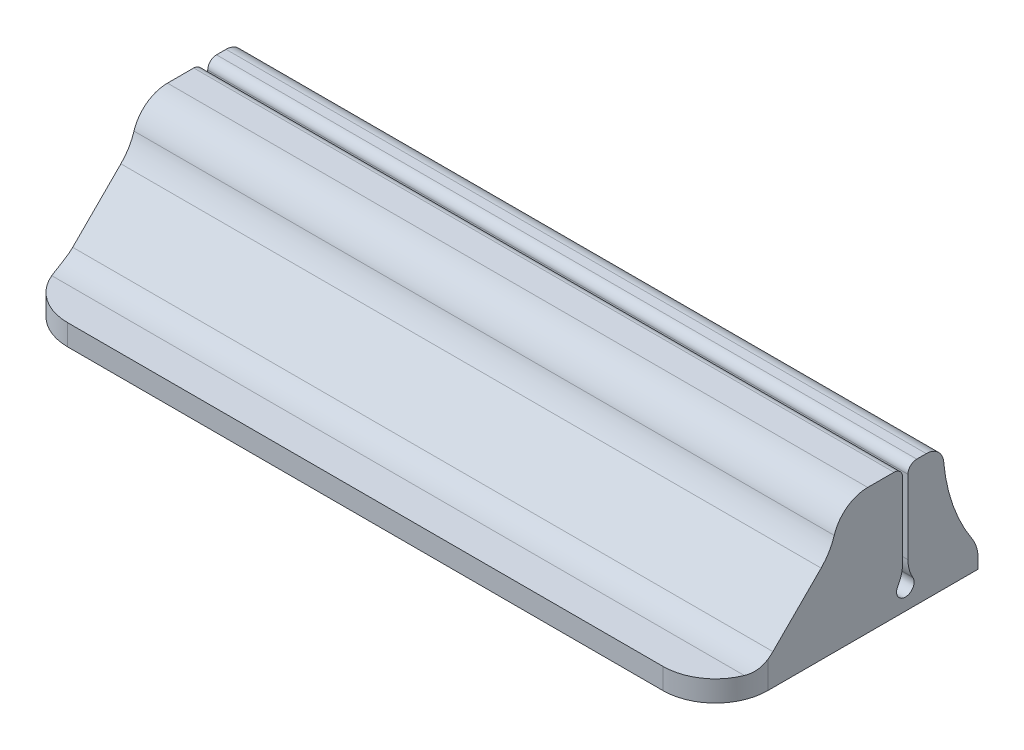
ISO-10303-21;
HEADER;
FILE_DESCRIPTION(('STEP AP214'),'2;1');
FILE_NAME('part.step','',(''),(''),'','','');
FILE_SCHEMA(('AUTOMOTIVE_DESIGN { 1 0 10303 214 1 1 1 1 }'));
ENDSEC;
DATA;
#1=APPLICATION_CONTEXT('core data for automotive mechanical design processes');
#2=APPLICATION_PROTOCOL_DEFINITION('international standard','automotive_design',2000,#1);
#3=PRODUCT_CONTEXT('',#1,'mechanical');
#4=PRODUCT('Part','Part','',(#3));
#5=PRODUCT_RELATED_PRODUCT_CATEGORY('part','',(#4));
#6=PRODUCT_DEFINITION_FORMATION('','',#4);
#7=PRODUCT_DEFINITION_CONTEXT('part definition',#1,'design');
#8=PRODUCT_DEFINITION('design','',#6,#7);
#9=PRODUCT_DEFINITION_SHAPE('','',#8);
#10=(LENGTH_UNIT() NAMED_UNIT(*) SI_UNIT(.MILLI.,.METRE.));
#11=(NAMED_UNIT(*) PLANE_ANGLE_UNIT() SI_UNIT($,.RADIAN.));
#12=(NAMED_UNIT(*) SI_UNIT($,.STERADIAN.) SOLID_ANGLE_UNIT());
#13=UNCERTAINTY_MEASURE_WITH_UNIT(LENGTH_MEASURE(1.E-05),#10,'distance_accuracy_value','');
#14=(GEOMETRIC_REPRESENTATION_CONTEXT(3) GLOBAL_UNCERTAINTY_ASSIGNED_CONTEXT((#13)) GLOBAL_UNIT_ASSIGNED_CONTEXT((#10,
#11,#12)) REPRESENTATION_CONTEXT('',''));
#15=CARTESIAN_POINT('',(0.,0.,0.));
#16=DIRECTION('',(0.,0.,1.));
#17=DIRECTION('',(1.,0.,0.));
#18=AXIS2_PLACEMENT_3D('',#15,#16,#17);
#19=CARTESIAN_POINT('',(0.,1.2,0.));
#20=DIRECTION('',(0.,1.,0.));
#21=DIRECTION('',(0.,0.,1.));
#22=AXIS2_PLACEMENT_3D('',#19,#20,#21);
#23=PLANE('',#22);
#24=DIRECTION('',(1.,0.,0.));
#25=VECTOR('',#24,1.);
#26=CARTESIAN_POINT('',(-20.,1.2,7.5));
#27=LINE('',#26,#25);
#28=CARTESIAN_POINT('',(-17.,1.2,7.5));
#29=VERTEX_POINT('',#28);
#30=CARTESIAN_POINT('',(17.,1.2,7.5));
#31=VERTEX_POINT('',#30);
#32=EDGE_CURVE('E236',#29,#31,#27,.T.);
#33=ORIENTED_EDGE('',*,*,#32,.T.);
#34=CARTESIAN_POINT('',(17.,1.2,4.5));
#35=DIRECTION('',(0.,1.,0.));
#36=DIRECTION('',(0.,0.,1.));
#37=AXIS2_PLACEMENT_3D('',#34,#35,#36);
#38=CIRCLE('',#37,3.);
#39=CARTESIAN_POINT('',(19.7796856340488,1.2,5.62842712474618));
#40=VERTEX_POINT('',#39);
#41=EDGE_CURVE('E340',#31,#40,#38,.T.);
#42=ORIENTED_EDGE('',*,*,#41,.T.);
#43=DIRECTION('',(-1.,0.,0.));
#44=VECTOR('',#43,1.);
#45=CARTESIAN_POINT('',(0.,1.2,5.62842712474618));
#46=LINE('',#45,#44);
#47=CARTESIAN_POINT('',(-19.7796856340488,1.2,5.62842712474618));
#48=VERTEX_POINT('',#47);
#49=EDGE_CURVE('E247',#40,#48,#46,.T.);
#50=ORIENTED_EDGE('',*,*,#49,.T.);
#51=CARTESIAN_POINT('',(-17.,1.2,4.5));
#52=DIRECTION('',(0.,1.,0.));
#53=DIRECTION('',(0.,0.,1.));
#54=AXIS2_PLACEMENT_3D('',#51,#52,#53);
#55=CIRCLE('',#54,3.);
#56=EDGE_CURVE('E338',#48,#29,#55,.T.);
#57=ORIENTED_EDGE('',*,*,#56,.T.);
#58=EDGE_LOOP('',(#33,#42,#50,#57));
#59=FACE_BOUND('',#58,.T.);
#60=ADVANCED_FACE('F53',(#59),#23,.T.);
#61=CARTESIAN_POINT('',(20.,1.2,-7.5));
#62=DIRECTION('',(-1.,0.,0.));
#63=DIRECTION('',(0.,0.,1.));
#64=AXIS2_PLACEMENT_3D('',#61,#62,#63);
#65=PLANE('',#64);
#66=CARTESIAN_POINT('',(20.,3.2,5.62842712474618));
#67=DIRECTION('',(-1.,0.,0.));
#68=DIRECTION('',(0.,0.,1.));
#69=AXIS2_PLACEMENT_3D('',#66,#67,#68);
#70=CIRCLE('',#69,2.);
#71=CARTESIAN_POINT('',(20.,1.78578643762691,4.21421356237308));
#72=VERTEX_POINT('',#71);
#73=CARTESIAN_POINT('',(20.,1.54874222965127,4.5));
#74=VERTEX_POINT('',#73);
#75=EDGE_CURVE('E262',#72,#74,#70,.T.);
#76=ORIENTED_EDGE('',*,*,#75,.T.);
#77=DIRECTION('',(0.,-1.,0.));
#78=VECTOR('',#77,1.);
#79=CARTESIAN_POINT('',(20.,1.2,4.5));
#80=LINE('',#79,#78);
#81=CARTESIAN_POINT('',(20.,0.,4.5));
#82=VERTEX_POINT('',#81);
#83=EDGE_CURVE('E211',#74,#82,#80,.T.);
#84=ORIENTED_EDGE('',*,*,#83,.T.);
#85=DIRECTION('',(0.,0.,-1.));
#86=VECTOR('',#85,1.);
#87=CARTESIAN_POINT('',(20.,0.,-7.5));
#88=LINE('',#87,#86);
#89=CARTESIAN_POINT('',(20.,0.,-7.5));
#90=VERTEX_POINT('',#89);
#91=EDGE_CURVE('E204',#82,#90,#88,.T.);
#92=ORIENTED_EDGE('',*,*,#91,.T.);
#93=DIRECTION('',(0.,-1.,0.));
#94=VECTOR('',#93,1.);
#95=CARTESIAN_POINT('',(20.,1.2,-7.5));
#96=LINE('',#95,#94);
#97=CARTESIAN_POINT('',(20.,0.566750419289201,-7.5));
#98=VERTEX_POINT('',#97);
#99=EDGE_CURVE('E208',#98,#90,#96,.T.);
#100=ORIENTED_EDGE('',*,*,#99,.F.);
#101=CARTESIAN_POINT('',(20.,0.566750419289201,-5.5));
#102=DIRECTION('',(-1.,0.,0.));
#103=DIRECTION('',(0.,0.,1.));
#104=AXIS2_PLACEMENT_3D('',#101,#102,#103);
#105=CIRCLE('',#104,2.);
#106=CARTESIAN_POINT('',(20.,1.67229201607433,-7.16666666666667));
#107=VERTEX_POINT('',#106);
#108=EDGE_CURVE('E299',#98,#107,#105,.F.);
#109=ORIENTED_EDGE('',*,*,#108,.T.);
#110=CARTESIAN_POINT('',(20.,7.2,-15.5));
#111=DIRECTION('',(-1.,0.,0.));
#112=DIRECTION('',(0.,0.,1.));
#113=AXIS2_PLACEMENT_3D('',#110,#111,#112);
#114=CIRCLE('',#113,10.);
#115=CARTESIAN_POINT('',(20.,6.29090909090909,-5.54140804536062));
#116=VERTEX_POINT('',#115);
#117=EDGE_CURVE('E240',#107,#116,#114,.T.);
#118=ORIENTED_EDGE('',*,*,#117,.T.);
#119=CARTESIAN_POINT('',(20.,6.2,-4.54554884989668));
#120=DIRECTION('',(-1.,0.,0.));
#121=DIRECTION('',(0.,0.,1.));
#122=AXIS2_PLACEMENT_3D('',#119,#120,#121);
#123=CIRCLE('',#122,1.);
#124=CARTESIAN_POINT('',(20.,7.2,-4.54554884989668));
#125=VERTEX_POINT('',#124);
#126=EDGE_CURVE('E291',#116,#125,#123,.F.);
#127=ORIENTED_EDGE('',*,*,#126,.T.);
#128=DIRECTION('',(0.,0.,-1.));
#129=VECTOR('',#128,1.);
#130=CARTESIAN_POINT('',(20.,7.2,-5.5));
#131=LINE('',#130,#129);
#132=CARTESIAN_POINT('',(20.,7.2,-4.));
#133=VERTEX_POINT('',#132);
#134=EDGE_CURVE('E444',#133,#125,#131,.T.);
#135=ORIENTED_EDGE('',*,*,#134,.F.);
#136=CARTESIAN_POINT('',(20.,6.7,-4.));
#137=DIRECTION('',(-1.,0.,0.));
#138=DIRECTION('',(0.,0.,1.));
#139=AXIS2_PLACEMENT_3D('',#136,#137,#138);
#140=CIRCLE('',#139,0.5);
#141=CARTESIAN_POINT('',(20.,6.7,-3.5));
#142=VERTEX_POINT('',#141);
#143=EDGE_CURVE('E269',#133,#142,#140,.F.);
#144=ORIENTED_EDGE('',*,*,#143,.T.);
#145=DIRECTION('',(0.,-1.,0.));
#146=VECTOR('',#145,1.);
#147=CARTESIAN_POINT('',(20.,7.2,-3.5));
#148=LINE('',#147,#146);
#149=CARTESIAN_POINT('',(20.,2.47573508221729,-3.5));
#150=VERTEX_POINT('',#149);
#151=EDGE_CURVE('E448',#142,#150,#148,.T.);
#152=ORIENTED_EDGE('',*,*,#151,.T.);
#153=CARTESIAN_POINT('',(20.,2.47573508221729,-5.50000000000001));
#154=DIRECTION('',(-1.,0.,0.));
#155=DIRECTION('',(0.,0.,1.));
#156=AXIS2_PLACEMENT_3D('',#153,#154,#155);
#157=CIRCLE('',#156,2.);
#158=CARTESIAN_POINT('',(20.,1.45514701644346,-3.78));
#159=VERTEX_POINT('',#158);
#160=EDGE_CURVE('E316',#150,#159,#157,.F.);
#161=ORIENTED_EDGE('',*,*,#160,.T.);
#162=CARTESIAN_POINT('',(20.,1.2,-3.35));
#163=DIRECTION('',(1.,0.,0.));
#164=DIRECTION('',(0.,0.,-1.));
#165=AXIS2_PLACEMENT_3D('',#162,#163,#164);
#166=CIRCLE('',#165,0.5);
#167=CARTESIAN_POINT('',(20.,1.45514701644346,-2.92));
#168=VERTEX_POINT('',#167);
#169=EDGE_CURVE('E491',#168,#159,#166,.T.);
#170=ORIENTED_EDGE('',*,*,#169,.F.);
#171=CARTESIAN_POINT('',(20.,2.47573508221732,-1.20000000000001));
#172=DIRECTION('',(-1.,0.,0.));
#173=DIRECTION('',(0.,0.,1.));
#174=AXIS2_PLACEMENT_3D('',#171,#172,#173);
#175=CIRCLE('',#174,2.);
#176=CARTESIAN_POINT('',(20.,2.47573508221732,-3.2));
#177=VERTEX_POINT('',#176);
#178=EDGE_CURVE('E318',#168,#177,#175,.F.);
#179=ORIENTED_EDGE('',*,*,#178,.T.);
#180=DIRECTION('',(0.,-1.,0.));
#181=VECTOR('',#180,1.);
#182=CARTESIAN_POINT('',(20.,7.2,-3.2));
#183=LINE('',#182,#181);
#184=CARTESIAN_POINT('',(20.,6.7,-3.2));
#185=VERTEX_POINT('',#184);
#186=EDGE_CURVE('E483',#185,#177,#183,.T.);
#187=ORIENTED_EDGE('',*,*,#186,.F.);
#188=CARTESIAN_POINT('',(20.,6.7,-2.7));
#189=DIRECTION('',(-1.,0.,0.));
#190=DIRECTION('',(0.,0.,1.));
#191=AXIS2_PLACEMENT_3D('',#188,#189,#190);
#192=CIRCLE('',#191,0.5);
#193=CARTESIAN_POINT('',(20.,7.2,-2.7));
#194=VERTEX_POINT('',#193);
#195=EDGE_CURVE('E267',#185,#194,#192,.F.);
#196=ORIENTED_EDGE('',*,*,#195,.T.);
#197=DIRECTION('',(0.,0.,-1.));
#198=VECTOR('',#197,1.);
#199=CARTESIAN_POINT('',(20.,7.2,-3.2));
#200=LINE('',#199,#198);
#201=CARTESIAN_POINT('',(20.,7.2,-1.2));
#202=VERTEX_POINT('',#201);
#203=EDGE_CURVE('E475',#202,#194,#200,.T.);
#204=ORIENTED_EDGE('',*,*,#203,.F.);
#205=CARTESIAN_POINT('',(20.,5.2,-1.2));
#206=DIRECTION('',(-1.,0.,0.));
#207=DIRECTION('',(0.,0.,1.));
#208=AXIS2_PLACEMENT_3D('',#205,#206,#207);
#209=CIRCLE('',#208,2.);
#210=CARTESIAN_POINT('',(20.,5.78431620583809,0.712740069009633));
#211=VERTEX_POINT('',#210);
#212=EDGE_CURVE('E255',#202,#211,#209,.F.);
#213=ORIENTED_EDGE('',*,*,#212,.T.);
#214=CARTESIAN_POINT('',(20.,6.66079051459522,3.58185017252408));
#215=DIRECTION('',(-1.,0.,0.));
#216=DIRECTION('',(0.,0.,1.));
#217=AXIS2_PLACEMENT_3D('',#214,#215,#216);
#218=CIRCLE('',#217,3.);
#219=CARTESIAN_POINT('',(20.,4.53947017103559,1.46052982896443));
#220=VERTEX_POINT('',#219);
#221=EDGE_CURVE('E306',#211,#220,#218,.T.);
#222=ORIENTED_EDGE('',*,*,#221,.T.);
#223=DIRECTION('',(0.,-0.707106781186551,0.707106781186544));
#224=VECTOR('',#223,1.);
#225=CARTESIAN_POINT('',(20.,7.34999999999999,-1.34999999999995));
#226=LINE('',#225,#224);
#227=EDGE_CURVE('E242',#220,#72,#226,.T.);
#228=ORIENTED_EDGE('',*,*,#227,.T.);
#229=EDGE_LOOP('',(#76,#84,#92,#100,#109,#118,#127,#135,#144,#152,#161,#170,#179,#187,#196,#204,
#213,#222,#228));
#230=FACE_BOUND('',#229,.T.);
#231=ADVANCED_FACE('F207',(#230),#65,.F.);
#232=CARTESIAN_POINT('',(-20.,1.2,-7.5));
#233=DIRECTION('',(0.,0.,1.));
#234=DIRECTION('',(1.,0.,0.));
#235=AXIS2_PLACEMENT_3D('',#232,#233,#234);
#236=PLANE('',#235);
#237=DIRECTION('',(0.,-1.,0.));
#238=VECTOR('',#237,1.);
#239=CARTESIAN_POINT('',(-20.,1.2,-7.5));
#240=LINE('',#239,#238);
#241=CARTESIAN_POINT('',(-20.,0.566750419289201,-7.5));
#242=VERTEX_POINT('',#241);
#243=CARTESIAN_POINT('',(-20.,0.,-7.5));
#244=VERTEX_POINT('',#243);
#245=EDGE_CURVE('E225',#242,#244,#240,.T.);
#246=ORIENTED_EDGE('',*,*,#245,.F.);
#247=DIRECTION('',(1.,0.,0.));
#248=VECTOR('',#247,1.);
#249=CARTESIAN_POINT('',(-20.,0.566750419289201,-7.5));
#250=LINE('',#249,#248);
#251=EDGE_CURVE('E223',#242,#98,#250,.T.);
#252=ORIENTED_EDGE('',*,*,#251,.T.);
#253=ORIENTED_EDGE('',*,*,#99,.T.);
#254=DIRECTION('',(-1.,0.,0.));
#255=VECTOR('',#254,1.);
#256=CARTESIAN_POINT('',(-20.,0.,-7.5));
#257=LINE('',#256,#255);
#258=EDGE_CURVE('E214',#90,#244,#257,.T.);
#259=ORIENTED_EDGE('',*,*,#258,.T.);
#260=EDGE_LOOP('',(#246,#252,#253,#259));
#261=FACE_BOUND('',#260,.T.);
#262=ADVANCED_FACE('F220',(#261),#236,.F.);
#263=CARTESIAN_POINT('',(-20.,1.2,-7.5));
#264=DIRECTION('',(1.,0.,0.));
#265=DIRECTION('',(0.,0.,-1.));
#266=AXIS2_PLACEMENT_3D('',#263,#264,#265);
#267=PLANE('',#266);
#268=DIRECTION('',(0.,0.,1.));
#269=VECTOR('',#268,1.);
#270=CARTESIAN_POINT('',(-20.,0.,-7.5));
#271=LINE('',#270,#269);
#272=CARTESIAN_POINT('',(-20.,0.,4.5));
#273=VERTEX_POINT('',#272);
#274=EDGE_CURVE('E228',#244,#273,#271,.T.);
#275=ORIENTED_EDGE('',*,*,#274,.T.);
#276=DIRECTION('',(0.,-1.,0.));
#277=VECTOR('',#276,1.);
#278=CARTESIAN_POINT('',(-20.,1.2,4.5));
#279=LINE('',#278,#277);
#280=CARTESIAN_POINT('',(-20.,1.54874222965127,4.5));
#281=VERTEX_POINT('',#280);
#282=EDGE_CURVE('E12',#273,#281,#279,.F.);
#283=ORIENTED_EDGE('',*,*,#282,.T.);
#284=CARTESIAN_POINT('',(-20.,3.2,5.62842712474618));
#285=DIRECTION('',(1.,0.,0.));
#286=DIRECTION('',(0.,0.,-1.));
#287=AXIS2_PLACEMENT_3D('',#284,#285,#286);
#288=CIRCLE('',#287,2.);
#289=CARTESIAN_POINT('',(-20.,1.78578643762691,4.21421356237308));
#290=VERTEX_POINT('',#289);
#291=EDGE_CURVE('E260',#281,#290,#288,.T.);
#292=ORIENTED_EDGE('',*,*,#291,.T.);
#293=DIRECTION('',(0.,0.707106781186551,-0.707106781186544));
#294=VECTOR('',#293,1.);
#295=CARTESIAN_POINT('',(-20.,7.34999999999999,-1.34999999999995));
#296=LINE('',#295,#294);
#297=CARTESIAN_POINT('',(-20.,4.53947017103559,1.46052982896443));
#298=VERTEX_POINT('',#297);
#299=EDGE_CURVE('E244',#290,#298,#296,.T.);
#300=ORIENTED_EDGE('',*,*,#299,.T.);
#301=CARTESIAN_POINT('',(-20.,6.66079051459522,3.58185017252408));
#302=DIRECTION('',(1.,0.,0.));
#303=DIRECTION('',(0.,0.,-1.));
#304=AXIS2_PLACEMENT_3D('',#301,#302,#303);
#305=CIRCLE('',#304,3.);
#306=CARTESIAN_POINT('',(-20.,5.78431620583809,0.712740069009633));
#307=VERTEX_POINT('',#306);
#308=EDGE_CURVE('E308',#298,#307,#305,.T.);
#309=ORIENTED_EDGE('',*,*,#308,.T.);
#310=CARTESIAN_POINT('',(-20.,5.2,-1.2));
#311=DIRECTION('',(1.,0.,0.));
#312=DIRECTION('',(0.,0.,-1.));
#313=AXIS2_PLACEMENT_3D('',#310,#311,#312);
#314=CIRCLE('',#313,2.);
#315=CARTESIAN_POINT('',(-20.,7.2,-1.2));
#316=VERTEX_POINT('',#315);
#317=EDGE_CURVE('E258',#307,#316,#314,.F.);
#318=ORIENTED_EDGE('',*,*,#317,.T.);
#319=DIRECTION('',(0.,0.,1.));
#320=VECTOR('',#319,1.);
#321=CARTESIAN_POINT('',(-20.,7.2,-3.2));
#322=LINE('',#321,#320);
#323=CARTESIAN_POINT('',(-20.,7.2,-2.7));
#324=VERTEX_POINT('',#323);
#325=EDGE_CURVE('E453',#324,#316,#322,.T.);
#326=ORIENTED_EDGE('',*,*,#325,.F.);
#327=CARTESIAN_POINT('',(-20.,6.7,-2.7));
#328=DIRECTION('',(1.,0.,0.));
#329=DIRECTION('',(0.,0.,-1.));
#330=AXIS2_PLACEMENT_3D('',#327,#328,#329);
#331=CIRCLE('',#330,0.5);
#332=CARTESIAN_POINT('',(-20.,6.7,-3.2));
#333=VERTEX_POINT('',#332);
#334=EDGE_CURVE('E273',#324,#333,#331,.F.);
#335=ORIENTED_EDGE('',*,*,#334,.T.);
#336=DIRECTION('',(0.,-1.,0.));
#337=VECTOR('',#336,1.);
#338=CARTESIAN_POINT('',(-20.,7.2,-3.2));
#339=LINE('',#338,#337);
#340=CARTESIAN_POINT('',(-20.,2.47573508221732,-3.2));
#341=VERTEX_POINT('',#340);
#342=EDGE_CURVE('E479',#333,#341,#339,.T.);
#343=ORIENTED_EDGE('',*,*,#342,.T.);
#344=CARTESIAN_POINT('',(-20.,2.47573508221732,-1.2));
#345=DIRECTION('',(1.,0.,0.));
#346=DIRECTION('',(0.,0.,-1.));
#347=AXIS2_PLACEMENT_3D('',#344,#345,#346);
#348=CIRCLE('',#347,2.);
#349=CARTESIAN_POINT('',(-20.,1.45514701644346,-2.91999999999999));
#350=VERTEX_POINT('',#349);
#351=EDGE_CURVE('E324',#341,#350,#348,.F.);
#352=ORIENTED_EDGE('',*,*,#351,.T.);
#353=CARTESIAN_POINT('',(-20.,1.2,-3.34999999999999));
#354=DIRECTION('',(1.,0.,0.));
#355=DIRECTION('',(0.,0.,-1.));
#356=AXIS2_PLACEMENT_3D('',#353,#354,#355);
#357=CIRCLE('',#356,0.5);
#358=CARTESIAN_POINT('',(-20.,1.45514701644346,-3.77999999999999));
#359=VERTEX_POINT('',#358);
#360=EDGE_CURVE('E488',#359,#350,#357,.F.);
#361=ORIENTED_EDGE('',*,*,#360,.F.);
#362=CARTESIAN_POINT('',(-20.,2.47573508221729,-5.5));
#363=DIRECTION('',(1.,0.,0.));
#364=DIRECTION('',(0.,0.,-1.));
#365=AXIS2_PLACEMENT_3D('',#362,#363,#364);
#366=CIRCLE('',#365,2.);
#367=CARTESIAN_POINT('',(-20.,2.47573508221729,-3.5));
#368=VERTEX_POINT('',#367);
#369=EDGE_CURVE('E322',#359,#368,#366,.F.);
#370=ORIENTED_EDGE('',*,*,#369,.T.);
#371=DIRECTION('',(0.,-1.,0.));
#372=VECTOR('',#371,1.);
#373=CARTESIAN_POINT('',(-20.,7.2,-3.5));
#374=LINE('',#373,#372);
#375=CARTESIAN_POINT('',(-20.,6.7,-3.5));
#376=VERTEX_POINT('',#375);
#377=EDGE_CURVE('E215',#376,#368,#374,.T.);
#378=ORIENTED_EDGE('',*,*,#377,.F.);
#379=CARTESIAN_POINT('',(-20.,6.7,-4.));
#380=DIRECTION('',(1.,0.,0.));
#381=DIRECTION('',(0.,0.,-1.));
#382=AXIS2_PLACEMENT_3D('',#379,#380,#381);
#383=CIRCLE('',#382,0.5);
#384=CARTESIAN_POINT('',(-20.,7.2,-4.));
#385=VERTEX_POINT('',#384);
#386=EDGE_CURVE('E275',#376,#385,#383,.F.);
#387=ORIENTED_EDGE('',*,*,#386,.T.);
#388=DIRECTION('',(0.,0.,1.));
#389=VECTOR('',#388,1.);
#390=CARTESIAN_POINT('',(-20.,7.2,-5.5));
#391=LINE('',#390,#389);
#392=CARTESIAN_POINT('',(-20.,7.2,-4.54554884989668));
#393=VERTEX_POINT('',#392);
#394=EDGE_CURVE('E449',#393,#385,#391,.T.);
#395=ORIENTED_EDGE('',*,*,#394,.F.);
#396=CARTESIAN_POINT('',(-20.,6.2,-4.54554884989668));
#397=DIRECTION('',(1.,0.,0.));
#398=DIRECTION('',(0.,0.,-1.));
#399=AXIS2_PLACEMENT_3D('',#396,#397,#398);
#400=CIRCLE('',#399,1.);
#401=CARTESIAN_POINT('',(-20.,6.29090909090909,-5.54140804536062));
#402=VERTEX_POINT('',#401);
#403=EDGE_CURVE('E286',#393,#402,#400,.F.);
#404=ORIENTED_EDGE('',*,*,#403,.T.);
#405=CARTESIAN_POINT('',(-20.,7.2,-15.5));
#406=DIRECTION('',(1.,0.,0.));
#407=DIRECTION('',(0.,0.,-1.));
#408=AXIS2_PLACEMENT_3D('',#405,#406,#407);
#409=CIRCLE('',#408,10.);
#410=CARTESIAN_POINT('',(-20.,1.67229201607433,-7.16666666666667));
#411=VERTEX_POINT('',#410);
#412=EDGE_CURVE('E224',#402,#411,#409,.T.);
#413=ORIENTED_EDGE('',*,*,#412,.T.);
#414=CARTESIAN_POINT('',(-20.,0.566750419289201,-5.5));
#415=DIRECTION('',(1.,0.,0.));
#416=DIRECTION('',(0.,0.,-1.));
#417=AXIS2_PLACEMENT_3D('',#414,#415,#416);
#418=CIRCLE('',#417,2.);
#419=EDGE_CURVE('E296',#411,#242,#418,.F.);
#420=ORIENTED_EDGE('',*,*,#419,.T.);
#421=ORIENTED_EDGE('',*,*,#245,.T.);
#422=EDGE_LOOP('',(#275,#283,#292,#300,#309,#318,#326,#335,#343,#352,#361,#370,#378,#387,#395,
#404,#413,#420,#421));
#423=FACE_BOUND('',#422,.T.);
#424=ADVANCED_FACE('F418',(#423),#267,.F.);
#425=CARTESIAN_POINT('',(-20.,1.2,7.5));
#426=DIRECTION('',(0.,0.,-1.));
#427=DIRECTION('',(-1.,0.,0.));
#428=AXIS2_PLACEMENT_3D('',#425,#426,#427);
#429=PLANE('',#428);
#430=DIRECTION('',(1.,0.,0.));
#431=VECTOR('',#430,1.);
#432=CARTESIAN_POINT('',(-20.,0.,7.5));
#433=LINE('',#432,#431);
#434=CARTESIAN_POINT('',(-17.,0.,7.5));
#435=VERTEX_POINT('',#434);
#436=CARTESIAN_POINT('',(17.,0.,7.5));
#437=VERTEX_POINT('',#436);
#438=EDGE_CURVE('E230',#435,#437,#433,.T.);
#439=ORIENTED_EDGE('',*,*,#438,.T.);
#440=DIRECTION('',(0.,-1.,0.));
#441=VECTOR('',#440,1.);
#442=CARTESIAN_POINT('',(17.,1.2,7.5));
#443=LINE('',#442,#441);
#444=EDGE_CURVE('E336',#437,#31,#443,.F.);
#445=ORIENTED_EDGE('',*,*,#444,.T.);
#446=ORIENTED_EDGE('',*,*,#32,.F.);
#447=DIRECTION('',(0.,-1.,0.));
#448=VECTOR('',#447,1.);
#449=CARTESIAN_POINT('',(-17.,1.2,7.5));
#450=LINE('',#449,#448);
#451=EDGE_CURVE('E333',#29,#435,#450,.T.);
#452=ORIENTED_EDGE('',*,*,#451,.T.);
#453=EDGE_LOOP('',(#439,#445,#446,#452));
#454=FACE_BOUND('',#453,.T.);
#455=ADVANCED_FACE('F415',(#454),#429,.F.);
#456=CARTESIAN_POINT('',(0.,0.,0.));
#457=DIRECTION('',(0.,1.,0.));
#458=DIRECTION('',(0.,0.,1.));
#459=AXIS2_PLACEMENT_3D('',#456,#457,#458);
#460=PLANE('',#459);
#461=ORIENTED_EDGE('',*,*,#91,.F.);
#462=CARTESIAN_POINT('',(17.,0.,4.5));
#463=DIRECTION('',(0.,1.,0.));
#464=DIRECTION('',(0.,0.,1.));
#465=AXIS2_PLACEMENT_3D('',#462,#463,#464);
#466=CIRCLE('',#465,3.);
#467=EDGE_CURVE('E331',#82,#437,#466,.F.);
#468=ORIENTED_EDGE('',*,*,#467,.T.);
#469=ORIENTED_EDGE('',*,*,#438,.F.);
#470=CARTESIAN_POINT('',(-17.,0.,4.5));
#471=DIRECTION('',(0.,1.,0.));
#472=DIRECTION('',(0.,0.,1.));
#473=AXIS2_PLACEMENT_3D('',#470,#471,#472);
#474=CIRCLE('',#473,3.);
#475=EDGE_CURVE('E329',#435,#273,#474,.F.);
#476=ORIENTED_EDGE('',*,*,#475,.T.);
#477=ORIENTED_EDGE('',*,*,#274,.F.);
#478=ORIENTED_EDGE('',*,*,#258,.F.);
#479=EDGE_LOOP('',(#461,#468,#469,#476,#477,#478));
#480=FACE_BOUND('',#479,.T.);
#481=ADVANCED_FACE('F227',(#480),#460,.F.);
#482=CARTESIAN_POINT('',(-20.,7.2,-3.5));
#483=DIRECTION('',(0.,0.,-1.));
#484=DIRECTION('',(-1.,0.,0.));
#485=AXIS2_PLACEMENT_3D('',#482,#483,#484);
#486=PLANE('',#485);
#487=ORIENTED_EDGE('',*,*,#377,.T.);
#488=DIRECTION('',(1.,0.,0.));
#489=VECTOR('',#488,1.);
#490=CARTESIAN_POINT('',(-20.,2.47573508221729,-3.5));
#491=LINE('',#490,#489);
#492=EDGE_CURVE('E326',#368,#150,#491,.T.);
#493=ORIENTED_EDGE('',*,*,#492,.T.);
#494=ORIENTED_EDGE('',*,*,#151,.F.);
#495=DIRECTION('',(1.,0.,0.));
#496=VECTOR('',#495,1.);
#497=CARTESIAN_POINT('',(-20.,6.7,-3.5));
#498=LINE('',#497,#496);
#499=EDGE_CURVE('E271',#142,#376,#498,.F.);
#500=ORIENTED_EDGE('',*,*,#499,.T.);
#501=EDGE_LOOP('',(#487,#493,#494,#500));
#502=FACE_BOUND('',#501,.T.);
#503=ADVANCED_FACE('F411',(#502),#486,.F.);
#504=CARTESIAN_POINT('',(0.,7.2,0.));
#505=DIRECTION('',(0.,1.,0.));
#506=DIRECTION('',(0.,0.,1.));
#507=AXIS2_PLACEMENT_3D('',#504,#505,#506);
#508=PLANE('',#507);
#509=ORIENTED_EDGE('',*,*,#134,.T.);
#510=DIRECTION('',(-1.,0.,0.));
#511=VECTOR('',#510,1.);
#512=CARTESIAN_POINT('',(-20.,7.2,-4.54554884989668));
#513=LINE('',#512,#511);
#514=EDGE_CURVE('E283',#125,#393,#513,.T.);
#515=ORIENTED_EDGE('',*,*,#514,.T.);
#516=ORIENTED_EDGE('',*,*,#394,.T.);
#517=DIRECTION('',(1.,0.,0.));
#518=VECTOR('',#517,1.);
#519=CARTESIAN_POINT('',(20.,7.2,-4.));
#520=LINE('',#519,#518);
#521=EDGE_CURVE('E264',#385,#133,#520,.T.);
#522=ORIENTED_EDGE('',*,*,#521,.T.);
#523=EDGE_LOOP('',(#509,#515,#516,#522));
#524=FACE_BOUND('',#523,.T.);
#525=ADVANCED_FACE('F446',(#524),#508,.T.);
#526=CARTESIAN_POINT('',(-20.,7.2,-3.2));
#527=DIRECTION('',(0.,0.,1.));
#528=DIRECTION('',(1.,0.,0.));
#529=AXIS2_PLACEMENT_3D('',#526,#527,#528);
#530=PLANE('',#529);
#531=ORIENTED_EDGE('',*,*,#186,.T.);
#532=DIRECTION('',(1.,0.,0.));
#533=VECTOR('',#532,1.);
#534=CARTESIAN_POINT('',(-20.,2.47573508221732,-3.2));
#535=LINE('',#534,#533);
#536=EDGE_CURVE('E320',#177,#341,#535,.F.);
#537=ORIENTED_EDGE('',*,*,#536,.T.);
#538=ORIENTED_EDGE('',*,*,#342,.F.);
#539=DIRECTION('',(-1.,0.,0.));
#540=VECTOR('',#539,1.);
#541=CARTESIAN_POINT('',(20.,6.7,-3.2));
#542=LINE('',#541,#540);
#543=EDGE_CURVE('E281',#333,#185,#542,.F.);
#544=ORIENTED_EDGE('',*,*,#543,.T.);
#545=EDGE_LOOP('',(#531,#537,#538,#544));
#546=FACE_BOUND('',#545,.T.);
#547=ADVANCED_FACE('F432',(#546),#530,.F.);
#548=CARTESIAN_POINT('',(0.,7.2,0.));
#549=DIRECTION('',(0.,1.,0.));
#550=DIRECTION('',(0.,0.,1.));
#551=AXIS2_PLACEMENT_3D('',#548,#549,#550);
#552=PLANE('',#551);
#553=ORIENTED_EDGE('',*,*,#203,.T.);
#554=DIRECTION('',(-1.,0.,0.));
#555=VECTOR('',#554,1.);
#556=CARTESIAN_POINT('',(-20.,7.2,-2.7));
#557=LINE('',#556,#555);
#558=EDGE_CURVE('E278',#194,#324,#557,.T.);
#559=ORIENTED_EDGE('',*,*,#558,.T.);
#560=ORIENTED_EDGE('',*,*,#325,.T.);
#561=DIRECTION('',(1.,0.,0.));
#562=VECTOR('',#561,1.);
#563=CARTESIAN_POINT('',(20.,7.2,-1.2));
#564=LINE('',#563,#562);
#565=EDGE_CURVE('E252',#316,#202,#564,.T.);
#566=ORIENTED_EDGE('',*,*,#565,.T.);
#567=EDGE_LOOP('',(#553,#559,#560,#566));
#568=FACE_BOUND('',#567,.T.);
#569=ADVANCED_FACE('F425',(#568),#552,.T.);
#570=CARTESIAN_POINT('',(0.,7.2,-15.5));
#571=DIRECTION('',(1.,0.,0.));
#572=DIRECTION('',(0.,0.,-1.));
#573=AXIS2_PLACEMENT_3D('',#570,#571,#572);
#574=CYLINDRICAL_SURFACE('',#573,10.);
#575=ORIENTED_EDGE('',*,*,#117,.F.);
#576=DIRECTION('',(1.,0.,0.));
#577=VECTOR('',#576,1.);
#578=CARTESIAN_POINT('',(0.,1.67229201607433,-7.16666666666667));
#579=LINE('',#578,#577);
#580=EDGE_CURVE('E293',#107,#411,#579,.F.);
#581=ORIENTED_EDGE('',*,*,#580,.T.);
#582=ORIENTED_EDGE('',*,*,#412,.F.);
#583=DIRECTION('',(1.,0.,0.));
#584=VECTOR('',#583,1.);
#585=CARTESIAN_POINT('',(0.,6.29090909090909,-5.54140804536062));
#586=LINE('',#585,#584);
#587=EDGE_CURVE('E288',#402,#116,#586,.T.);
#588=ORIENTED_EDGE('',*,*,#587,.T.);
#589=EDGE_LOOP('',(#575,#581,#582,#588));
#590=FACE_BOUND('',#589,.T.);
#591=ADVANCED_FACE('F423',(#590),#574,.F.);
#592=CARTESIAN_POINT('',(-20.,5.20000000000003,0.799999999999999));
#593=DIRECTION('',(0.,-0.707106781186544,-0.707106781186551));
#594=DIRECTION('',(1.,0.,0.));
#595=AXIS2_PLACEMENT_3D('',#592,#593,#594);
#596=PLANE('',#595);
#597=ORIENTED_EDGE('',*,*,#227,.F.);
#598=DIRECTION('',(-1.,0.,0.));
#599=VECTOR('',#598,1.);
#600=CARTESIAN_POINT('',(-20.,4.53947017103559,1.46052982896443));
#601=LINE('',#600,#599);
#602=EDGE_CURVE('E304',#220,#298,#601,.T.);
#603=ORIENTED_EDGE('',*,*,#602,.T.);
#604=ORIENTED_EDGE('',*,*,#299,.F.);
#605=DIRECTION('',(-1.,0.,0.));
#606=VECTOR('',#605,1.);
#607=CARTESIAN_POINT('',(-20.,1.78578643762691,4.21421356237308));
#608=LINE('',#607,#606);
#609=EDGE_CURVE('E249',#290,#72,#608,.F.);
#610=ORIENTED_EDGE('',*,*,#609,.T.);
#611=EDGE_LOOP('',(#597,#603,#604,#610));
#612=FACE_BOUND('',#611,.T.);
#613=ADVANCED_FACE('F357',(#612),#596,.F.);
#614=CARTESIAN_POINT('',(0.,3.2,5.62842712474618));
#615=DIRECTION('',(-1.,0.,0.));
#616=DIRECTION('',(0.,0.,1.));
#617=AXIS2_PLACEMENT_3D('',#614,#615,#616);
#618=CYLINDRICAL_SURFACE('',#617,2.);
#619=ORIENTED_EDGE('',*,*,#49,.F.);
#620=CARTESIAN_POINT('',(19.7796856340488,1.2,5.62842712474618));
#621=CARTESIAN_POINT('',(19.7983727343965,1.20000016522855,5.58240283553385));
#622=CARTESIAN_POINT('',(19.8159013424369,1.20159127305198,5.53593085839633));
#623=CARTESIAN_POINT('',(19.8485755370173,1.20811902940669,5.44237692427082));
#624=CARTESIAN_POINT('',(19.8637205331044,1.21305650527629,5.39529481926227));
#625=CARTESIAN_POINT('',(19.9046266558614,1.23272838142875,5.25645177612307));
#626=CARTESIAN_POINT('',(19.9269929842213,1.25230890083069,5.16427445924136));
#627=CARTESIAN_POINT('',(19.9543688987382,1.29290687786292,5.02371648426323));
#628=CARTESIAN_POINT('',(19.9626433334175,1.3092035650873,4.97451908085072));
#629=CARTESIAN_POINT('',(19.9765984405251,1.34572433256265,4.8771892884727));
#630=CARTESIAN_POINT('',(19.9822782610856,1.36594969958223,4.8290572542192));
#631=CARTESIAN_POINT('',(19.9913574635378,1.41093378475913,4.73279563378124));
#632=CARTESIAN_POINT('',(19.9946758289472,1.43581956747857,4.68471803838641));
#633=CARTESIAN_POINT('',(19.9990007922583,1.48944217597344,4.59067360980362));
#634=CARTESIAN_POINT('',(20.0000082439347,1.51817757534109,4.5447060032264));
#635=CARTESIAN_POINT('',(20.,1.54874222965127,4.5));
#636=B_SPLINE_CURVE_WITH_KNOTS('',3,(#620,#621,#622,#623,#624,#625,#626,#627,#628,#629,#630,
#631,#632,#633,#634,#635),.UNSPECIFIED.,.F.,.F.,(4,2,2,2,2,2,2,4),(0.,0.148931447843957,
0.29789973014963,0.586830117275584,0.744097650490755,0.901416780987247,1.06390235386702,
1.22632788624038),.UNSPECIFIED.);
#637=EDGE_CURVE('E62',#40,#74,#636,.T.);
#638=ORIENTED_EDGE('',*,*,#637,.T.);
#639=ORIENTED_EDGE('',*,*,#75,.F.);
#640=ORIENTED_EDGE('',*,*,#609,.F.);
#641=ORIENTED_EDGE('',*,*,#291,.F.);
#642=CARTESIAN_POINT('',(-20.,1.54874222965127,4.5));
#643=CARTESIAN_POINT('',(-20.0000001363474,1.52072236425618,4.54100247804692));
#644=CARTESIAN_POINT('',(-19.999157571013,1.49424457167193,4.58303056826038));
#645=CARTESIAN_POINT('',(-19.9955516831607,1.44451042266484,4.66888402796295));
#646=CARTESIAN_POINT('',(-19.9927879084986,1.42125482611045,4.71270981824399));
#647=CARTESIAN_POINT('',(-19.9814943666377,1.35785019815067,4.84377712184713));
#648=CARTESIAN_POINT('',(-19.9699869001343,1.32235766817173,4.93312283663594));
#649=CARTESIAN_POINT('',(-19.9451997692204,1.27797011265484,5.07300023173467));
#650=CARTESIAN_POINT('',(-19.9351137511452,1.26432337930904,5.12267826969954));
#651=CARTESIAN_POINT('',(-19.9121818908468,1.24098850786678,5.22236212806999));
#652=CARTESIAN_POINT('',(-19.8993351518005,1.23130165911784,5.27236804985911));
#653=CARTESIAN_POINT('',(-19.8704165563516,1.21558542818984,5.37382997001901));
#654=CARTESIAN_POINT('',(-19.854252688066,1.20968652084872,5.42527969480651));
#655=CARTESIAN_POINT('',(-19.8190801195897,1.20188894058608,5.52748625090438));
#656=CARTESIAN_POINT('',(-19.8000724677179,1.19998879745185,5.57824333005584));
#657=CARTESIAN_POINT('',(-19.7796856340488,1.2,5.62842712474618));
#658=B_SPLINE_CURVE_WITH_KNOTS('',3,(#642,#643,#644,#645,#646,#647,#648,#649,#650,#651,#652,
#653,#654,#655,#656,#657),.UNSPECIFIED.,.F.,.F.,(4,2,2,2,2,2,2,4),(0.,0.148893456140178,
0.297821965260429,0.58667488034523,0.743982678701641,0.901341656120044,1.06386524947373,
1.22632907785673),.UNSPECIFIED.);
#659=EDGE_CURVE('E74',#281,#48,#658,.T.);
#660=ORIENTED_EDGE('',*,*,#659,.T.);
#661=EDGE_LOOP('',(#619,#638,#639,#640,#641,#660));
#662=FACE_BOUND('',#661,.T.);
#663=ADVANCED_FACE('F351',(#662),#618,.F.);
#664=CARTESIAN_POINT('',(0.,5.2,-1.2));
#665=DIRECTION('',(-1.,0.,0.));
#666=DIRECTION('',(0.,0.,1.));
#667=AXIS2_PLACEMENT_3D('',#664,#665,#666);
#668=CYLINDRICAL_SURFACE('',#667,2.);
#669=ORIENTED_EDGE('',*,*,#317,.F.);
#670=DIRECTION('',(-1.,0.,0.));
#671=VECTOR('',#670,1.);
#672=CARTESIAN_POINT('',(0.,5.78431620583809,0.712740069009633));
#673=LINE('',#672,#671);
#674=EDGE_CURVE('E301',#307,#211,#673,.F.);
#675=ORIENTED_EDGE('',*,*,#674,.T.);
#676=ORIENTED_EDGE('',*,*,#212,.F.);
#677=ORIENTED_EDGE('',*,*,#565,.F.);
#678=EDGE_LOOP('',(#669,#675,#676,#677));
#679=FACE_BOUND('',#678,.T.);
#680=ADVANCED_FACE('F356',(#679),#668,.T.);
#681=CARTESIAN_POINT('',(0.,6.7,-4.));
#682=DIRECTION('',(-1.,0.,0.));
#683=DIRECTION('',(0.,0.,1.));
#684=AXIS2_PLACEMENT_3D('',#681,#682,#683);
#685=CYLINDRICAL_SURFACE('',#684,0.5);
#686=ORIENTED_EDGE('',*,*,#386,.F.);
#687=ORIENTED_EDGE('',*,*,#499,.F.);
#688=ORIENTED_EDGE('',*,*,#143,.F.);
#689=ORIENTED_EDGE('',*,*,#521,.F.);
#690=EDGE_LOOP('',(#686,#687,#688,#689));
#691=FACE_BOUND('',#690,.T.);
#692=ADVANCED_FACE('F363',(#691),#685,.T.);
#693=CARTESIAN_POINT('',(0.,6.7,-2.7));
#694=DIRECTION('',(1.,0.,0.));
#695=DIRECTION('',(0.,0.,-1.));
#696=AXIS2_PLACEMENT_3D('',#693,#694,#695);
#697=CYLINDRICAL_SURFACE('',#696,0.5);
#698=ORIENTED_EDGE('',*,*,#195,.F.);
#699=ORIENTED_EDGE('',*,*,#543,.F.);
#700=ORIENTED_EDGE('',*,*,#334,.F.);
#701=ORIENTED_EDGE('',*,*,#558,.F.);
#702=EDGE_LOOP('',(#698,#699,#700,#701));
#703=FACE_BOUND('',#702,.T.);
#704=ADVANCED_FACE('F367',(#703),#697,.T.);
#705=CARTESIAN_POINT('',(-20.001,1.2,-3.34999999999999));
#706=DIRECTION('',(1.,0.,0.));
#707=DIRECTION('',(0.,0.,-1.));
#708=AXIS2_PLACEMENT_3D('',#705,#706,#707);
#709=CYLINDRICAL_SURFACE('',#708,0.5);
#710=ORIENTED_EDGE('',*,*,#360,.T.);
#711=DIRECTION('',(1.,0.,0.));
#712=VECTOR('',#711,1.);
#713=CARTESIAN_POINT('',(-20.001,1.45514701644346,-2.91999999999999));
#714=LINE('',#713,#712);
#715=EDGE_CURVE('E313',#350,#168,#714,.T.);
#716=ORIENTED_EDGE('',*,*,#715,.T.);
#717=ORIENTED_EDGE('',*,*,#169,.T.);
#718=DIRECTION('',(1.,0.,0.));
#719=VECTOR('',#718,1.);
#720=CARTESIAN_POINT('',(-20.001,1.45514701644346,-3.77999999999999));
#721=LINE('',#720,#719);
#722=EDGE_CURVE('E310',#159,#359,#721,.F.);
#723=ORIENTED_EDGE('',*,*,#722,.T.);
#724=EDGE_LOOP('',(#710,#716,#717,#723));
#725=FACE_BOUND('',#724,.T.);
#726=ADVANCED_FACE('F371',(#725),#709,.F.);
#727=CARTESIAN_POINT('',(0.,6.2,-4.54554884989668));
#728=DIRECTION('',(1.,0.,0.));
#729=DIRECTION('',(0.,0.,-1.));
#730=AXIS2_PLACEMENT_3D('',#727,#728,#729);
#731=CYLINDRICAL_SURFACE('',#730,1.);
#732=ORIENTED_EDGE('',*,*,#126,.F.);
#733=ORIENTED_EDGE('',*,*,#587,.F.);
#734=ORIENTED_EDGE('',*,*,#403,.F.);
#735=ORIENTED_EDGE('',*,*,#514,.F.);
#736=EDGE_LOOP('',(#732,#733,#734,#735));
#737=FACE_BOUND('',#736,.T.);
#738=ADVANCED_FACE('F373',(#737),#731,.T.);
#739=CARTESIAN_POINT('',(0.,0.566750419289201,-5.5));
#740=DIRECTION('',(1.,0.,0.));
#741=DIRECTION('',(0.,0.,-1.));
#742=AXIS2_PLACEMENT_3D('',#739,#740,#741);
#743=CYLINDRICAL_SURFACE('',#742,2.);
#744=ORIENTED_EDGE('',*,*,#108,.F.);
#745=ORIENTED_EDGE('',*,*,#251,.F.);
#746=ORIENTED_EDGE('',*,*,#419,.F.);
#747=ORIENTED_EDGE('',*,*,#580,.F.);
#748=EDGE_LOOP('',(#744,#745,#746,#747));
#749=FACE_BOUND('',#748,.T.);
#750=ADVANCED_FACE('F376',(#749),#743,.T.);
#751=CARTESIAN_POINT('',(0.,6.66079051459522,3.58185017252408));
#752=DIRECTION('',(-1.,0.,0.));
#753=DIRECTION('',(0.,0.,1.));
#754=AXIS2_PLACEMENT_3D('',#751,#752,#753);
#755=CYLINDRICAL_SURFACE('',#754,3.);
#756=ORIENTED_EDGE('',*,*,#308,.F.);
#757=ORIENTED_EDGE('',*,*,#602,.F.);
#758=ORIENTED_EDGE('',*,*,#221,.F.);
#759=ORIENTED_EDGE('',*,*,#674,.F.);
#760=EDGE_LOOP('',(#756,#757,#758,#759));
#761=FACE_BOUND('',#760,.T.);
#762=ADVANCED_FACE('F380',(#761),#755,.F.);
#763=CARTESIAN_POINT('',(-20.001,2.47573508221732,-1.2));
#764=DIRECTION('',(1.,0.,0.));
#765=DIRECTION('',(0.,0.,-1.));
#766=AXIS2_PLACEMENT_3D('',#763,#764,#765);
#767=CYLINDRICAL_SURFACE('',#766,2.);
#768=ORIENTED_EDGE('',*,*,#351,.F.);
#769=ORIENTED_EDGE('',*,*,#536,.F.);
#770=ORIENTED_EDGE('',*,*,#178,.F.);
#771=ORIENTED_EDGE('',*,*,#715,.F.);
#772=EDGE_LOOP('',(#768,#769,#770,#771));
#773=FACE_BOUND('',#772,.T.);
#774=ADVANCED_FACE('F384',(#773),#767,.T.);
#775=CARTESIAN_POINT('',(-20.001,2.47573508221729,-5.5));
#776=DIRECTION('',(1.,0.,0.));
#777=DIRECTION('',(0.,0.,-1.));
#778=AXIS2_PLACEMENT_3D('',#775,#776,#777);
#779=CYLINDRICAL_SURFACE('',#778,2.);
#780=ORIENTED_EDGE('',*,*,#160,.F.);
#781=ORIENTED_EDGE('',*,*,#492,.F.);
#782=ORIENTED_EDGE('',*,*,#369,.F.);
#783=ORIENTED_EDGE('',*,*,#722,.F.);
#784=EDGE_LOOP('',(#780,#781,#782,#783));
#785=FACE_BOUND('',#784,.T.);
#786=ADVANCED_FACE('F388',(#785),#779,.T.);
#787=CARTESIAN_POINT('',(17.,1.2,4.5));
#788=DIRECTION('',(0.,-1.,0.));
#789=DIRECTION('',(0.,0.,-1.));
#790=AXIS2_PLACEMENT_3D('',#787,#788,#789);
#791=CYLINDRICAL_SURFACE('',#790,3.);
#792=ORIENTED_EDGE('',*,*,#41,.F.);
#793=ORIENTED_EDGE('',*,*,#444,.F.);
#794=ORIENTED_EDGE('',*,*,#467,.F.);
#795=ORIENTED_EDGE('',*,*,#83,.F.);
#796=ORIENTED_EDGE('',*,*,#637,.F.);
#797=EDGE_LOOP('',(#792,#793,#794,#795,#796));
#798=FACE_BOUND('',#797,.T.);
#799=ADVANCED_FACE('F391',(#798),#791,.T.);
#800=CARTESIAN_POINT('',(-17.,1.2,4.5));
#801=DIRECTION('',(0.,-1.,0.));
#802=DIRECTION('',(0.,0.,-1.));
#803=AXIS2_PLACEMENT_3D('',#800,#801,#802);
#804=CYLINDRICAL_SURFACE('',#803,3.);
#805=ORIENTED_EDGE('',*,*,#659,.F.);
#806=ORIENTED_EDGE('',*,*,#282,.F.);
#807=ORIENTED_EDGE('',*,*,#475,.F.);
#808=ORIENTED_EDGE('',*,*,#451,.F.);
#809=ORIENTED_EDGE('',*,*,#56,.F.);
#810=EDGE_LOOP('',(#805,#806,#807,#808,#809));
#811=FACE_BOUND('',#810,.T.);
#812=ADVANCED_FACE('F55',(#811),#804,.T.);
#813=CLOSED_SHELL('',(#60,#231,#262,#424,#455,#481,#503,#525,#547,#569,#591,#613,#663,#680,#692,
#704,#726,#738,#750,#762,#774,#786,#799,#812));
#814=MANIFOLD_SOLID_BREP('B2',#813);
#815=ADVANCED_BREP_SHAPE_REPRESENTATION('',(#18,#814),#14);
#816=SHAPE_DEFINITION_REPRESENTATION(#9,#815);
ENDSEC;
END-ISO-10303-21;
